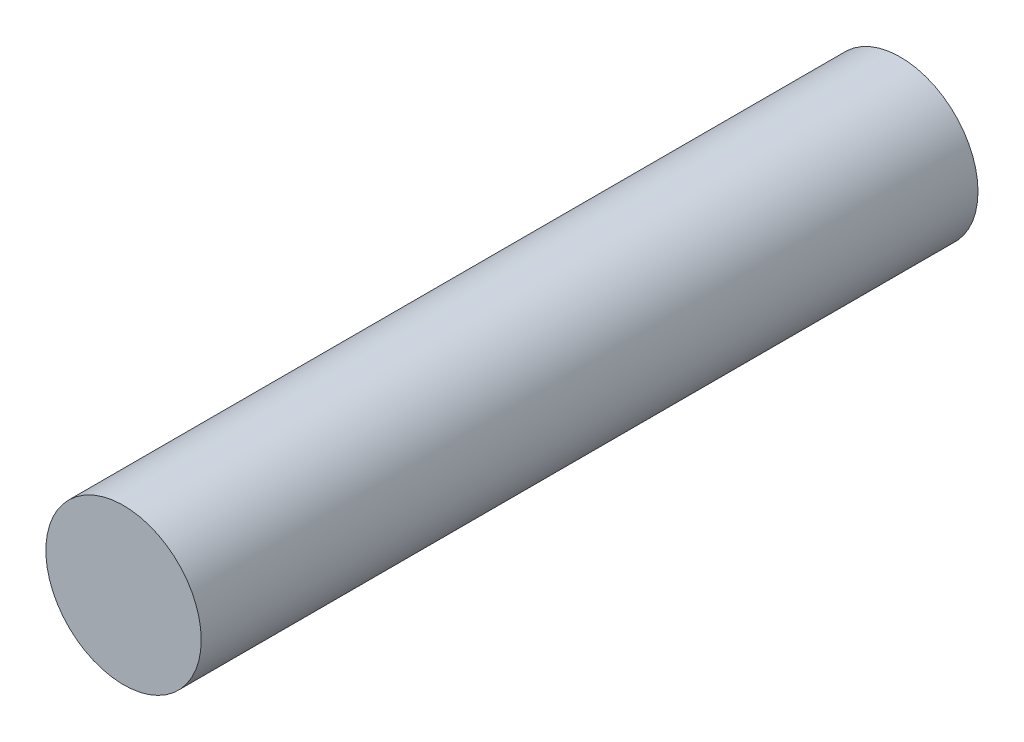
ISO-10303-21;
HEADER;
FILE_DESCRIPTION(('STEP AP214'),'2;1');
FILE_NAME('part.step','',(''),(''),'','','');
FILE_SCHEMA(('AUTOMOTIVE_DESIGN { 1 0 10303 214 1 1 1 1 }'));
ENDSEC;
DATA;
#1=APPLICATION_CONTEXT('core data for automotive mechanical design processes');
#2=APPLICATION_PROTOCOL_DEFINITION('international standard','automotive_design',2000,#1);
#3=PRODUCT_CONTEXT('',#1,'mechanical');
#4=PRODUCT('Part','Part','',(#3));
#5=PRODUCT_RELATED_PRODUCT_CATEGORY('part','',(#4));
#6=PRODUCT_DEFINITION_FORMATION('','',#4);
#7=PRODUCT_DEFINITION_CONTEXT('part definition',#1,'design');
#8=PRODUCT_DEFINITION('design','',#6,#7);
#9=PRODUCT_DEFINITION_SHAPE('','',#8);
#10=(LENGTH_UNIT() NAMED_UNIT(*) SI_UNIT(.MILLI.,.METRE.));
#11=(NAMED_UNIT(*) PLANE_ANGLE_UNIT() SI_UNIT($,.RADIAN.));
#12=(NAMED_UNIT(*) SI_UNIT($,.STERADIAN.) SOLID_ANGLE_UNIT());
#13=UNCERTAINTY_MEASURE_WITH_UNIT(LENGTH_MEASURE(1.E-05),#10,'distance_accuracy_value','');
#14=(GEOMETRIC_REPRESENTATION_CONTEXT(3) GLOBAL_UNCERTAINTY_ASSIGNED_CONTEXT((#13)) GLOBAL_UNIT_ASSIGNED_CONTEXT((#10,
#11,#12)) REPRESENTATION_CONTEXT('',''));
#15=CARTESIAN_POINT('',(0.,0.,0.));
#16=DIRECTION('',(0.,0.,1.));
#17=DIRECTION('',(1.,0.,0.));
#18=AXIS2_PLACEMENT_3D('',#15,#16,#17);
#19=CARTESIAN_POINT('',(-35.2099660203246,21.8776665800217,8.));
#20=DIRECTION('',(0.,0.,-1.));
#21=DIRECTION('',(-1.,0.,0.));
#22=AXIS2_PLACEMENT_3D('',#19,#20,#21);
#23=CYLINDRICAL_SURFACE('',#22,0.800000000000003);
#24=CARTESIAN_POINT('',(-35.2099660203246,21.8776665800217,8.));
#25=DIRECTION('',(0.,0.,1.));
#26=DIRECTION('',(1.,0.,0.));
#27=AXIS2_PLACEMENT_3D('',#24,#25,#26);
#28=CIRCLE('',#27,0.800000000000003);
#29=CARTESIAN_POINT('',(-34.4099660203246,21.8776665800217,8.));
#30=VERTEX_POINT('',#29);
#31=EDGE_CURVE('E10',#30,#30,#28,.T.);
#32=ORIENTED_EDGE('',*,*,#31,.F.);
#33=EDGE_LOOP('',(#32));
#34=FACE_BOUND('',#33,.T.);
#35=CARTESIAN_POINT('',(-35.2099660203246,21.8776665800217,0.));
#36=DIRECTION('',(0.,0.,1.));
#37=DIRECTION('',(1.,0.,0.));
#38=AXIS2_PLACEMENT_3D('',#35,#36,#37);
#39=CIRCLE('',#38,0.800000000000003);
#40=CARTESIAN_POINT('',(-34.4099660203246,21.8776665800217,0.));
#41=VERTEX_POINT('',#40);
#42=EDGE_CURVE('E33',#41,#41,#39,.T.);
#43=ORIENTED_EDGE('',*,*,#42,.T.);
#44=EDGE_LOOP('',(#43));
#45=FACE_BOUND('',#44,.T.);
#46=ADVANCED_FACE('F30',(#34,#45),#23,.T.);
#47=CARTESIAN_POINT('',(-35.2099660203246,21.8776665800217,8.));
#48=DIRECTION('',(0.,0.,1.));
#49=DIRECTION('',(1.,0.,0.));
#50=AXIS2_PLACEMENT_3D('',#47,#48,#49);
#51=PLANE('',#50);
#52=ORIENTED_EDGE('',*,*,#31,.T.);
#53=EDGE_LOOP('',(#52));
#54=FACE_BOUND('',#53,.T.);
#55=ADVANCED_FACE('F45',(#54),#51,.T.);
#56=CARTESIAN_POINT('',(-35.2099660203246,21.8776665800217,0.));
#57=DIRECTION('',(0.,0.,1.));
#58=DIRECTION('',(1.,0.,0.));
#59=AXIS2_PLACEMENT_3D('',#56,#57,#58);
#60=PLANE('',#59);
#61=ORIENTED_EDGE('',*,*,#42,.F.);
#62=EDGE_LOOP('',(#61));
#63=FACE_BOUND('',#62,.T.);
#64=ADVANCED_FACE('F43',(#63),#60,.F.);
#65=CLOSED_SHELL('',(#46,#55,#64));
#66=MANIFOLD_SOLID_BREP('B2',#65);
#67=ADVANCED_BREP_SHAPE_REPRESENTATION('',(#18,#66),#14);
#68=SHAPE_DEFINITION_REPRESENTATION(#9,#67);
ENDSEC;
END-ISO-10303-21;
